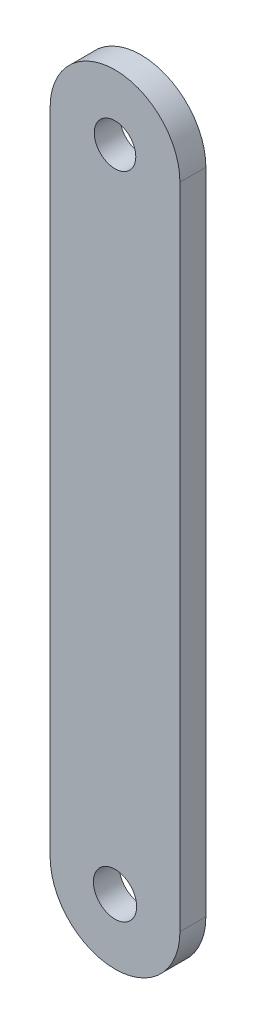
ISO-10303-21;
HEADER;
FILE_DESCRIPTION(('STEP AP214'),'2;1');
FILE_NAME('part.step','',(''),(''),'','','');
FILE_SCHEMA(('AUTOMOTIVE_DESIGN { 1 0 10303 214 1 1 1 1 }'));
ENDSEC;
DATA;
#1=APPLICATION_CONTEXT('core data for automotive mechanical design processes');
#2=APPLICATION_PROTOCOL_DEFINITION('international standard','automotive_design',2000,#1);
#3=PRODUCT_CONTEXT('',#1,'mechanical');
#4=PRODUCT('Part','Part','',(#3));
#5=PRODUCT_RELATED_PRODUCT_CATEGORY('part','',(#4));
#6=PRODUCT_DEFINITION_FORMATION('','',#4);
#7=PRODUCT_DEFINITION_CONTEXT('part definition',#1,'design');
#8=PRODUCT_DEFINITION('design','',#6,#7);
#9=PRODUCT_DEFINITION_SHAPE('','',#8);
#10=(LENGTH_UNIT() NAMED_UNIT(*) SI_UNIT(.MILLI.,.METRE.));
#11=(NAMED_UNIT(*) PLANE_ANGLE_UNIT() SI_UNIT($,.RADIAN.));
#12=(NAMED_UNIT(*) SI_UNIT($,.STERADIAN.) SOLID_ANGLE_UNIT());
#13=UNCERTAINTY_MEASURE_WITH_UNIT(LENGTH_MEASURE(1.E-05),#10,'distance_accuracy_value','');
#14=(GEOMETRIC_REPRESENTATION_CONTEXT(3) GLOBAL_UNCERTAINTY_ASSIGNED_CONTEXT((#13)) GLOBAL_UNIT_ASSIGNED_CONTEXT((#10,
#11,#12)) REPRESENTATION_CONTEXT('',''));
#15=CARTESIAN_POINT('',(0.,0.,0.));
#16=DIRECTION('',(0.,0.,1.));
#17=DIRECTION('',(1.,0.,0.));
#18=AXIS2_PLACEMENT_3D('',#15,#16,#17);
#19=CARTESIAN_POINT('',(193.325363727816,60.5329132080078,3.));
#20=DIRECTION('',(0.,0.,1.));
#21=DIRECTION('',(1.,0.,0.));
#22=AXIS2_PLACEMENT_3D('',#19,#20,#21);
#23=PLANE('',#22);
#24=CARTESIAN_POINT('',(193.325363727816,60.5329132080078,3.));
#25=DIRECTION('',(0.,0.,1.));
#26=DIRECTION('',(1.,0.,0.));
#27=AXIS2_PLACEMENT_3D('',#24,#25,#26);
#28=CIRCLE('',#27,2.5);
#29=CARTESIAN_POINT('',(195.825363727816,60.5329132080078,3.));
#30=VERTEX_POINT('',#29);
#31=EDGE_CURVE('E106',#30,#30,#28,.T.);
#32=ORIENTED_EDGE('',*,*,#31,.F.);
#33=EDGE_LOOP('',(#32));
#34=FACE_BOUND('',#33,.T.);
#35=CARTESIAN_POINT('',(193.325363727816,60.5329132080078,3.));
#36=DIRECTION('',(0.,0.,1.));
#37=DIRECTION('',(1.,0.,0.));
#38=AXIS2_PLACEMENT_3D('',#35,#36,#37);
#39=CIRCLE('',#38,7.50000000000001);
#40=CARTESIAN_POINT('',(185.825363727816,60.5329132080078,3.));
#41=VERTEX_POINT('',#40);
#42=CARTESIAN_POINT('',(200.825363727816,60.5329132080078,3.));
#43=VERTEX_POINT('',#42);
#44=EDGE_CURVE('E91',#41,#43,#39,.T.);
#45=ORIENTED_EDGE('',*,*,#44,.T.);
#46=DIRECTION('',(0.,1.,0.));
#47=VECTOR('',#46,1.);
#48=CARTESIAN_POINT('',(200.825363727816,60.5329132080078,3.));
#49=LINE('',#48,#47);
#50=CARTESIAN_POINT('',(200.825363727816,135.532913208008,3.));
#51=VERTEX_POINT('',#50);
#52=EDGE_CURVE('E86',#43,#51,#49,.T.);
#53=ORIENTED_EDGE('',*,*,#52,.T.);
#54=CARTESIAN_POINT('',(193.325363727816,135.532913208008,3.));
#55=DIRECTION('',(0.,0.,1.));
#56=DIRECTION('',(1.,0.,0.));
#57=AXIS2_PLACEMENT_3D('',#54,#55,#56);
#58=CIRCLE('',#57,7.49999999999999);
#59=CARTESIAN_POINT('',(185.825363727816,135.532913208008,3.));
#60=VERTEX_POINT('',#59);
#61=EDGE_CURVE('E89',#51,#60,#58,.T.);
#62=ORIENTED_EDGE('',*,*,#61,.T.);
#63=DIRECTION('',(0.,-1.,0.));
#64=VECTOR('',#63,1.);
#65=CARTESIAN_POINT('',(185.825363727816,60.5329132080078,3.));
#66=LINE('',#65,#64);
#67=EDGE_CURVE('E56',#60,#41,#66,.T.);
#68=ORIENTED_EDGE('',*,*,#67,.T.);
#69=EDGE_LOOP('',(#45,#53,#62,#68));
#70=FACE_BOUND('',#69,.T.);
#71=CARTESIAN_POINT('',(193.325363727816,135.532913208008,3.));
#72=DIRECTION('',(0.,0.,1.));
#73=DIRECTION('',(1.,0.,0.));
#74=AXIS2_PLACEMENT_3D('',#71,#72,#73);
#75=CIRCLE('',#74,2.4);
#76=CARTESIAN_POINT('',(195.725363727816,135.532913208008,3.));
#77=VERTEX_POINT('',#76);
#78=EDGE_CURVE('E121',#77,#77,#75,.T.);
#79=ORIENTED_EDGE('',*,*,#78,.F.);
#80=EDGE_LOOP('',(#79));
#81=FACE_BOUND('',#80,.T.);
#82=ADVANCED_FACE('F39',(#34,#70,#81),#23,.T.);
#83=CARTESIAN_POINT('',(193.325363727816,60.5329132080078,0.));
#84=DIRECTION('',(0.,0.,1.));
#85=DIRECTION('',(1.,0.,0.));
#86=AXIS2_PLACEMENT_3D('',#83,#84,#85);
#87=PLANE('',#86);
#88=CARTESIAN_POINT('',(193.325363727816,60.5329132080078,0.));
#89=DIRECTION('',(0.,0.,1.));
#90=DIRECTION('',(1.,0.,0.));
#91=AXIS2_PLACEMENT_3D('',#88,#89,#90);
#92=CIRCLE('',#91,7.50000000000001);
#93=CARTESIAN_POINT('',(185.825363727816,60.5329132080078,0.));
#94=VERTEX_POINT('',#93);
#95=CARTESIAN_POINT('',(200.825363727816,60.5329132080078,0.));
#96=VERTEX_POINT('',#95);
#97=EDGE_CURVE('E103',#94,#96,#92,.T.);
#98=ORIENTED_EDGE('',*,*,#97,.F.);
#99=DIRECTION('',(0.,-1.,0.));
#100=VECTOR('',#99,1.);
#101=CARTESIAN_POINT('',(185.825363727816,60.5329132080078,0.));
#102=LINE('',#101,#100);
#103=CARTESIAN_POINT('',(185.825363727816,135.532913208008,0.));
#104=VERTEX_POINT('',#103);
#105=EDGE_CURVE('E79',#104,#94,#102,.T.);
#106=ORIENTED_EDGE('',*,*,#105,.F.);
#107=CARTESIAN_POINT('',(193.325363727816,135.532913208008,0.));
#108=DIRECTION('',(0.,0.,1.));
#109=DIRECTION('',(1.,0.,0.));
#110=AXIS2_PLACEMENT_3D('',#107,#108,#109);
#111=CIRCLE('',#110,7.49999999999999);
#112=CARTESIAN_POINT('',(200.825363727816,135.532913208008,0.));
#113=VERTEX_POINT('',#112);
#114=EDGE_CURVE('E73',#113,#104,#111,.T.);
#115=ORIENTED_EDGE('',*,*,#114,.F.);
#116=DIRECTION('',(0.,1.,0.));
#117=VECTOR('',#116,1.);
#118=CARTESIAN_POINT('',(200.825363727816,60.5329132080078,0.));
#119=LINE('',#118,#117);
#120=EDGE_CURVE('E95',#96,#113,#119,.T.);
#121=ORIENTED_EDGE('',*,*,#120,.F.);
#122=EDGE_LOOP('',(#98,#106,#115,#121));
#123=FACE_BOUND('',#122,.T.);
#124=CARTESIAN_POINT('',(193.325363727816,60.5329132080078,0.));
#125=DIRECTION('',(0.,0.,1.));
#126=DIRECTION('',(1.,0.,0.));
#127=AXIS2_PLACEMENT_3D('',#124,#125,#126);
#128=CIRCLE('',#127,2.5);
#129=CARTESIAN_POINT('',(195.825363727816,60.5329132080078,0.));
#130=VERTEX_POINT('',#129);
#131=EDGE_CURVE('E118',#130,#130,#128,.T.);
#132=ORIENTED_EDGE('',*,*,#131,.T.);
#133=EDGE_LOOP('',(#132));
#134=FACE_BOUND('',#133,.T.);
#135=CARTESIAN_POINT('',(193.325363727816,135.532913208008,0.));
#136=DIRECTION('',(0.,0.,1.));
#137=DIRECTION('',(1.,0.,0.));
#138=AXIS2_PLACEMENT_3D('',#135,#136,#137);
#139=CIRCLE('',#138,2.4);
#140=CARTESIAN_POINT('',(195.725363727816,135.532913208008,0.));
#141=VERTEX_POINT('',#140);
#142=EDGE_CURVE('E124',#141,#141,#139,.T.);
#143=ORIENTED_EDGE('',*,*,#142,.T.);
#144=EDGE_LOOP('',(#143));
#145=FACE_BOUND('',#144,.T.);
#146=ADVANCED_FACE('F114',(#123,#134,#145),#87,.F.);
#147=CARTESIAN_POINT('',(193.325363727816,60.5329132080078,3.));
#148=DIRECTION('',(0.,0.,-1.));
#149=DIRECTION('',(-1.,0.,0.));
#150=AXIS2_PLACEMENT_3D('',#147,#148,#149);
#151=CYLINDRICAL_SURFACE('',#150,7.50000000000001);
#152=ORIENTED_EDGE('',*,*,#97,.T.);
#153=DIRECTION('',(0.,0.,-1.));
#154=VECTOR('',#153,1.);
#155=CARTESIAN_POINT('',(200.825363727816,60.5329132080078,3.));
#156=LINE('',#155,#154);
#157=EDGE_CURVE('E11',#43,#96,#156,.T.);
#158=ORIENTED_EDGE('',*,*,#157,.F.);
#159=ORIENTED_EDGE('',*,*,#44,.F.);
#160=DIRECTION('',(0.,0.,-1.));
#161=VECTOR('',#160,1.);
#162=CARTESIAN_POINT('',(185.825363727816,60.5329132080078,3.));
#163=LINE('',#162,#161);
#164=EDGE_CURVE('E99',#41,#94,#163,.T.);
#165=ORIENTED_EDGE('',*,*,#164,.T.);
#166=EDGE_LOOP('',(#152,#158,#159,#165));
#167=FACE_BOUND('',#166,.T.);
#168=ADVANCED_FACE('F41',(#167),#151,.T.);
#169=CARTESIAN_POINT('',(200.825363727816,60.5329132080078,3.));
#170=DIRECTION('',(-1.,0.,0.));
#171=DIRECTION('',(0.,0.,1.));
#172=AXIS2_PLACEMENT_3D('',#169,#170,#171);
#173=PLANE('',#172);
#174=ORIENTED_EDGE('',*,*,#120,.T.);
#175=DIRECTION('',(0.,0.,-1.));
#176=VECTOR('',#175,1.);
#177=CARTESIAN_POINT('',(200.825363727816,135.532913208008,3.));
#178=LINE('',#177,#176);
#179=EDGE_CURVE('E48',#51,#113,#178,.T.);
#180=ORIENTED_EDGE('',*,*,#179,.F.);
#181=ORIENTED_EDGE('',*,*,#52,.F.);
#182=ORIENTED_EDGE('',*,*,#157,.T.);
#183=EDGE_LOOP('',(#174,#180,#181,#182));
#184=FACE_BOUND('',#183,.T.);
#185=ADVANCED_FACE('F94',(#184),#173,.F.);
#186=CARTESIAN_POINT('',(193.325363727816,135.532913208008,3.));
#187=DIRECTION('',(0.,0.,-1.));
#188=DIRECTION('',(-1.,0.,0.));
#189=AXIS2_PLACEMENT_3D('',#186,#187,#188);
#190=CYLINDRICAL_SURFACE('',#189,7.49999999999999);
#191=ORIENTED_EDGE('',*,*,#114,.T.);
#192=DIRECTION('',(0.,0.,-1.));
#193=VECTOR('',#192,1.);
#194=CARTESIAN_POINT('',(185.825363727816,135.532913208008,3.));
#195=LINE('',#194,#193);
#196=EDGE_CURVE('E96',#60,#104,#195,.T.);
#197=ORIENTED_EDGE('',*,*,#196,.F.);
#198=ORIENTED_EDGE('',*,*,#61,.F.);
#199=ORIENTED_EDGE('',*,*,#179,.T.);
#200=EDGE_LOOP('',(#191,#197,#198,#199));
#201=FACE_BOUND('',#200,.T.);
#202=ADVANCED_FACE('F97',(#201),#190,.T.);
#203=CARTESIAN_POINT('',(185.825363727816,60.5329132080078,3.));
#204=DIRECTION('',(1.,0.,0.));
#205=DIRECTION('',(0.,1.,0.));
#206=AXIS2_PLACEMENT_3D('',#203,#204,#205);
#207=PLANE('',#206);
#208=ORIENTED_EDGE('',*,*,#105,.T.);
#209=ORIENTED_EDGE('',*,*,#164,.F.);
#210=ORIENTED_EDGE('',*,*,#67,.F.);
#211=ORIENTED_EDGE('',*,*,#196,.T.);
#212=EDGE_LOOP('',(#208,#209,#210,#211));
#213=FACE_BOUND('',#212,.T.);
#214=ADVANCED_FACE('F111',(#213),#207,.F.);
#215=CARTESIAN_POINT('',(193.325363727816,60.5329132080078,3.));
#216=DIRECTION('',(0.,0.,-1.));
#217=DIRECTION('',(-1.,0.,0.));
#218=AXIS2_PLACEMENT_3D('',#215,#216,#217);
#219=CYLINDRICAL_SURFACE('',#218,2.5);
#220=ORIENTED_EDGE('',*,*,#31,.T.);
#221=EDGE_LOOP('',(#220));
#222=FACE_BOUND('',#221,.T.);
#223=ORIENTED_EDGE('',*,*,#131,.F.);
#224=EDGE_LOOP('',(#223));
#225=FACE_BOUND('',#224,.T.);
#226=ADVANCED_FACE('F141',(#222,#225),#219,.F.);
#227=CARTESIAN_POINT('',(193.325363727816,135.532913208008,3.));
#228=DIRECTION('',(0.,0.,-1.));
#229=DIRECTION('',(-1.,0.,0.));
#230=AXIS2_PLACEMENT_3D('',#227,#228,#229);
#231=CYLINDRICAL_SURFACE('',#230,2.4);
#232=ORIENTED_EDGE('',*,*,#78,.T.);
#233=EDGE_LOOP('',(#232));
#234=FACE_BOUND('',#233,.T.);
#235=ORIENTED_EDGE('',*,*,#142,.F.);
#236=EDGE_LOOP('',(#235));
#237=FACE_BOUND('',#236,.T.);
#238=ADVANCED_FACE('F130',(#234,#237),#231,.F.);
#239=CLOSED_SHELL('',(#82,#146,#168,#185,#202,#214,#226,#238));
#240=MANIFOLD_SOLID_BREP('B2',#239);
#241=ADVANCED_BREP_SHAPE_REPRESENTATION('',(#18,#240),#14);
#242=SHAPE_DEFINITION_REPRESENTATION(#9,#241);
ENDSEC;
END-ISO-10303-21;
